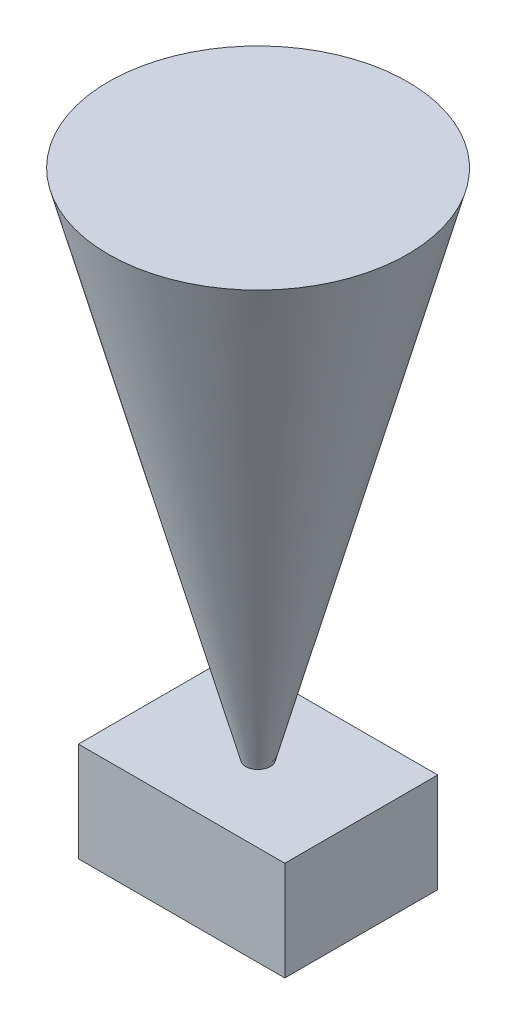
ISO-10303-21;
HEADER;
FILE_DESCRIPTION(('STEP AP214'),'2;1');
FILE_NAME('part.step','',(''),(''),'','','');
FILE_SCHEMA(('AUTOMOTIVE_DESIGN { 1 0 10303 214 1 1 1 1 }'));
ENDSEC;
DATA;
#1=APPLICATION_CONTEXT('core data for automotive mechanical design processes');
#2=APPLICATION_PROTOCOL_DEFINITION('international standard','automotive_design',2000,#1);
#3=PRODUCT_CONTEXT('',#1,'mechanical');
#4=PRODUCT('Part','Part','',(#3));
#5=PRODUCT_RELATED_PRODUCT_CATEGORY('part','',(#4));
#6=PRODUCT_DEFINITION_FORMATION('','',#4);
#7=PRODUCT_DEFINITION_CONTEXT('part definition',#1,'design');
#8=PRODUCT_DEFINITION('design','',#6,#7);
#9=PRODUCT_DEFINITION_SHAPE('','',#8);
#10=(LENGTH_UNIT() NAMED_UNIT(*) SI_UNIT(.MILLI.,.METRE.));
#11=(NAMED_UNIT(*) PLANE_ANGLE_UNIT() SI_UNIT($,.RADIAN.));
#12=(NAMED_UNIT(*) SI_UNIT($,.STERADIAN.) SOLID_ANGLE_UNIT());
#13=UNCERTAINTY_MEASURE_WITH_UNIT(LENGTH_MEASURE(1.E-05),#10,'distance_accuracy_value','');
#14=(GEOMETRIC_REPRESENTATION_CONTEXT(3) GLOBAL_UNCERTAINTY_ASSIGNED_CONTEXT((#13)) GLOBAL_UNIT_ASSIGNED_CONTEXT((#10,
#11,#12)) REPRESENTATION_CONTEXT('',''));
#15=CARTESIAN_POINT('',(0.,0.,0.));
#16=DIRECTION('',(0.,0.,1.));
#17=DIRECTION('',(1.,0.,0.));
#18=AXIS2_PLACEMENT_3D('',#15,#16,#17);
#19=CARTESIAN_POINT('',(0.,0.,0.));
#20=DIRECTION('',(0.,1.,0.));
#21=DIRECTION('',(0.,0.,1.));
#22=AXIS2_PLACEMENT_3D('',#19,#20,#21);
#23=PLANE('',#22);
#24=DIRECTION('',(1.,0.,0.));
#25=VECTOR('',#24,1.);
#26=CARTESIAN_POINT('',(1.35,0.,-1.));
#27=LINE('',#26,#25);
#28=CARTESIAN_POINT('',(-1.35,0.,-1.));
#29=VERTEX_POINT('',#28);
#30=CARTESIAN_POINT('',(1.35,0.,-1.));
#31=VERTEX_POINT('',#30);
#32=EDGE_CURVE('P0_E80',#29,#31,#27,.T.);
#33=ORIENTED_EDGE('',*,*,#32,.T.);
#34=DIRECTION('',(0.,0.,1.));
#35=VECTOR('',#34,1.);
#36=CARTESIAN_POINT('',(1.35,0.,1.));
#37=LINE('',#36,#35);
#38=CARTESIAN_POINT('',(1.35,0.,1.));
#39=VERTEX_POINT('',#38);
#40=EDGE_CURVE('P0_E67',#31,#39,#37,.T.);
#41=ORIENTED_EDGE('',*,*,#40,.T.);
#42=DIRECTION('',(-1.,0.,0.));
#43=VECTOR('',#42,1.);
#44=CARTESIAN_POINT('',(1.35,0.,1.));
#45=LINE('',#44,#43);
#46=CARTESIAN_POINT('',(-1.35,0.,1.));
#47=VERTEX_POINT('',#46);
#48=EDGE_CURVE('P0_E54',#39,#47,#45,.T.);
#49=ORIENTED_EDGE('',*,*,#48,.T.);
#50=DIRECTION('',(0.,0.,-1.));
#51=VECTOR('',#50,1.);
#52=CARTESIAN_POINT('',(-1.35,0.,1.));
#53=LINE('',#52,#51);
#54=EDGE_CURVE('P0_E19',#47,#29,#53,.T.);
#55=ORIENTED_EDGE('',*,*,#54,.T.);
#56=EDGE_LOOP('',(#33,#41,#49,#55));
#57=FACE_BOUND('',#56,.T.);
#58=ADVANCED_FACE('P0_F16',(#57),#23,.F.);
#59=CARTESIAN_POINT('',(-1.35,1.3,1.));
#60=DIRECTION('',(1.,0.,0.));
#61=DIRECTION('',(0.,0.,-1.));
#62=AXIS2_PLACEMENT_3D('',#59,#60,#61);
#63=PLANE('',#62);
#64=DIRECTION('',(0.,1.,0.));
#65=VECTOR('',#64,1.);
#66=CARTESIAN_POINT('',(-1.35,1.3,1.));
#67=LINE('',#66,#65);
#68=CARTESIAN_POINT('',(-1.35,1.3,1.));
#69=VERTEX_POINT('',#68);
#70=EDGE_CURVE('P0_E60',#47,#69,#67,.T.);
#71=ORIENTED_EDGE('',*,*,#70,.T.);
#72=DIRECTION('',(0.,0.,1.));
#73=VECTOR('',#72,1.);
#74=CARTESIAN_POINT('',(-1.35,1.3,0.));
#75=LINE('',#74,#73);
#76=CARTESIAN_POINT('',(-1.35,1.3,-1.));
#77=VERTEX_POINT('',#76);
#78=EDGE_CURVE('P0_E82',#77,#69,#75,.T.);
#79=ORIENTED_EDGE('',*,*,#78,.F.);
#80=DIRECTION('',(0.,1.,0.));
#81=VECTOR('',#80,1.);
#82=CARTESIAN_POINT('',(-1.35,1.3,-1.));
#83=LINE('',#82,#81);
#84=EDGE_CURVE('P0_E63',#77,#29,#83,.F.);
#85=ORIENTED_EDGE('',*,*,#84,.T.);
#86=ORIENTED_EDGE('',*,*,#54,.F.);
#87=EDGE_LOOP('',(#71,#79,#85,#86));
#88=FACE_BOUND('',#87,.T.);
#89=ADVANCED_FACE('P0_F59',(#88),#63,.F.);
#90=CARTESIAN_POINT('',(1.35,1.3,1.));
#91=DIRECTION('',(0.,0.,-1.));
#92=DIRECTION('',(-1.,0.,0.));
#93=AXIS2_PLACEMENT_3D('',#90,#91,#92);
#94=PLANE('',#93);
#95=DIRECTION('',(0.,1.,0.));
#96=VECTOR('',#95,1.);
#97=CARTESIAN_POINT('',(1.35,1.3,1.));
#98=LINE('',#97,#96);
#99=CARTESIAN_POINT('',(1.35,1.3,1.));
#100=VERTEX_POINT('',#99);
#101=EDGE_CURVE('P0_E69',#39,#100,#98,.T.);
#102=ORIENTED_EDGE('',*,*,#101,.T.);
#103=DIRECTION('',(1.,0.,0.));
#104=VECTOR('',#103,1.);
#105=CARTESIAN_POINT('',(0.,1.3,1.));
#106=LINE('',#105,#104);
#107=EDGE_CURVE('P0_E73',#69,#100,#106,.T.);
#108=ORIENTED_EDGE('',*,*,#107,.F.);
#109=ORIENTED_EDGE('',*,*,#70,.F.);
#110=ORIENTED_EDGE('',*,*,#48,.F.);
#111=EDGE_LOOP('',(#102,#108,#109,#110));
#112=FACE_BOUND('',#111,.T.);
#113=ADVANCED_FACE('P0_F71',(#112),#94,.F.);
#114=CARTESIAN_POINT('',(1.35,1.3,1.));
#115=DIRECTION('',(-1.,0.,0.));
#116=DIRECTION('',(0.,0.,1.));
#117=AXIS2_PLACEMENT_3D('',#114,#115,#116);
#118=PLANE('',#117);
#119=DIRECTION('',(0.,1.,0.));
#120=VECTOR('',#119,1.);
#121=CARTESIAN_POINT('',(1.35,1.3,-1.));
#122=LINE('',#121,#120);
#123=CARTESIAN_POINT('',(1.35,1.3,-1.));
#124=VERTEX_POINT('',#123);
#125=EDGE_CURVE('P0_E34',#31,#124,#122,.T.);
#126=ORIENTED_EDGE('',*,*,#125,.T.);
#127=DIRECTION('',(0.,0.,1.));
#128=VECTOR('',#127,1.);
#129=CARTESIAN_POINT('',(1.35,1.3,0.));
#130=LINE('',#129,#128);
#131=EDGE_CURVE('P0_E25',#100,#124,#130,.F.);
#132=ORIENTED_EDGE('',*,*,#131,.F.);
#133=ORIENTED_EDGE('',*,*,#101,.F.);
#134=ORIENTED_EDGE('',*,*,#40,.F.);
#135=EDGE_LOOP('',(#126,#132,#133,#134));
#136=FACE_BOUND('',#135,.T.);
#137=ADVANCED_FACE('P0_F88',(#136),#118,.F.);
#138=CARTESIAN_POINT('',(1.35,1.3,-1.));
#139=DIRECTION('',(0.,0.,1.));
#140=DIRECTION('',(1.,0.,0.));
#141=AXIS2_PLACEMENT_3D('',#138,#139,#140);
#142=PLANE('',#141);
#143=ORIENTED_EDGE('',*,*,#84,.F.);
#144=DIRECTION('',(1.,0.,0.));
#145=VECTOR('',#144,1.);
#146=CARTESIAN_POINT('',(0.,1.3,-1.));
#147=LINE('',#146,#145);
#148=EDGE_CURVE('P0_E11',#124,#77,#147,.F.);
#149=ORIENTED_EDGE('',*,*,#148,.F.);
#150=ORIENTED_EDGE('',*,*,#125,.F.);
#151=ORIENTED_EDGE('',*,*,#32,.F.);
#152=EDGE_LOOP('',(#143,#149,#150,#151));
#153=FACE_BOUND('',#152,.T.);
#154=ADVANCED_FACE('P0_F90',(#153),#142,.F.);
#155=CARTESIAN_POINT('',(0.,1.3,0.));
#156=DIRECTION('',(0.,1.,0.));
#157=DIRECTION('',(0.,0.,1.));
#158=AXIS2_PLACEMENT_3D('',#155,#156,#157);
#159=PLANE('',#158);
#160=ORIENTED_EDGE('',*,*,#131,.T.);
#161=ORIENTED_EDGE('',*,*,#148,.T.);
#162=ORIENTED_EDGE('',*,*,#78,.T.);
#163=ORIENTED_EDGE('',*,*,#107,.T.);
#164=EDGE_LOOP('',(#160,#161,#162,#163));
#165=FACE_BOUND('',#164,.T.);
#166=ADVANCED_FACE('P0_F87',(#165),#159,.T.);
#167=CLOSED_SHELL('',(#58,#89,#113,#137,#154,#166));
#168=MANIFOLD_SOLID_BREP('P0_B1',#167);
#169=CARTESIAN_POINT('',(0.,8.,0.));
#170=DIRECTION('',(0.,1.,0.));
#171=DIRECTION('',(0.,0.,1.));
#172=AXIS2_PLACEMENT_3D('',#169,#170,#171);
#173=PLANE('',#172);
#174=CARTESIAN_POINT('',(0.,8.00000000000001,0.));
#175=DIRECTION('',(0.,1.,0.));
#176=DIRECTION('',(0.,0.,1.));
#177=AXIS2_PLACEMENT_3D('',#174,#175,#176);
#178=CIRCLE('',#177,1.95602910474713);
#179=CARTESIAN_POINT('',(0.,8.00000000000001,1.95602910474713));
#180=VERTEX_POINT('',#179);
#181=EDGE_CURVE('P1_E11',#180,#180,#178,.F.);
#182=ORIENTED_EDGE('',*,*,#181,.F.);
#183=EDGE_LOOP('',(#182));
#184=FACE_BOUND('',#183,.T.);
#185=ADVANCED_FACE('P1_F16',(#184),#173,.T.);
#186=CARTESIAN_POINT('',(0.,8.00000000000001,0.));
#187=DIRECTION('',(0.,1.,0.));
#188=DIRECTION('',(0.,0.,1.));
#189=AXIS2_PLACEMENT_3D('',#186,#187,#188);
#190=CONICAL_SURFACE('',#189,1.95602910474713,0.261799387799139);
#191=CARTESIAN_POINT('',(0.,0.700000000000367,1.11022302462516E-13));
#192=VERTEX_POINT('',#191);
#193=VERTEX_LOOP('',#192);
#194=FACE_BOUND('',#193,.T.);
#195=ORIENTED_EDGE('',*,*,#181,.T.);
#196=EDGE_LOOP('',(#195));
#197=FACE_BOUND('',#196,.T.);
#198=ADVANCED_FACE('P1_F23',(#194,#197),#190,.T.);
#199=CLOSED_SHELL('',(#185,#198));
#200=MANIFOLD_SOLID_BREP('P1_B1',#199);
#201=ADVANCED_BREP_SHAPE_REPRESENTATION('',(#18,#168,#200),#14);
#202=SHAPE_DEFINITION_REPRESENTATION(#9,#201);
ENDSEC;
END-ISO-10303-21;
